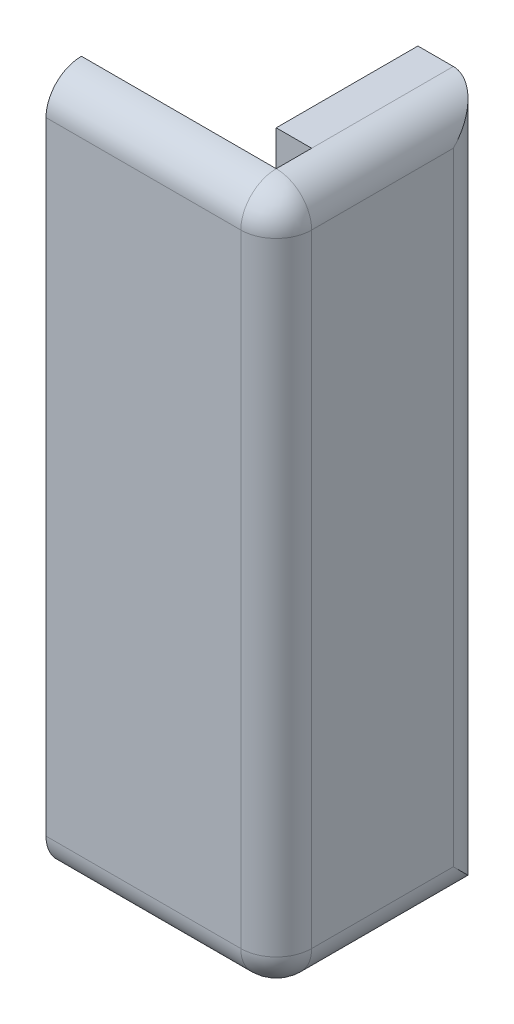
ISO-10303-21;
HEADER;
FILE_DESCRIPTION(('STEP AP214'),'2;1');
FILE_NAME('part.step','',(''),(''),'','','');
FILE_SCHEMA(('AUTOMOTIVE_DESIGN { 1 0 10303 214 1 1 1 1 }'));
ENDSEC;
DATA;
#1=APPLICATION_CONTEXT('core data for automotive mechanical design processes');
#2=APPLICATION_PROTOCOL_DEFINITION('international standard','automotive_design',2000,#1);
#3=PRODUCT_CONTEXT('',#1,'mechanical');
#4=PRODUCT('Part','Part','',(#3));
#5=PRODUCT_RELATED_PRODUCT_CATEGORY('part','',(#4));
#6=PRODUCT_DEFINITION_FORMATION('','',#4);
#7=PRODUCT_DEFINITION_CONTEXT('part definition',#1,'design');
#8=PRODUCT_DEFINITION('design','',#6,#7);
#9=PRODUCT_DEFINITION_SHAPE('','',#8);
#10=(LENGTH_UNIT() NAMED_UNIT(*) SI_UNIT(.MILLI.,.METRE.));
#11=(NAMED_UNIT(*) PLANE_ANGLE_UNIT() SI_UNIT($,.RADIAN.));
#12=(NAMED_UNIT(*) SI_UNIT($,.STERADIAN.) SOLID_ANGLE_UNIT());
#13=UNCERTAINTY_MEASURE_WITH_UNIT(LENGTH_MEASURE(1.E-05),#10,'distance_accuracy_value','');
#14=(GEOMETRIC_REPRESENTATION_CONTEXT(3) GLOBAL_UNCERTAINTY_ASSIGNED_CONTEXT((#13)) GLOBAL_UNIT_ASSIGNED_CONTEXT((#10,
#11,#12)) REPRESENTATION_CONTEXT('',''));
#15=CARTESIAN_POINT('',(0.,0.,0.));
#16=DIRECTION('',(0.,0.,1.));
#17=DIRECTION('',(1.,0.,0.));
#18=AXIS2_PLACEMENT_3D('',#15,#16,#17);
#19=CARTESIAN_POINT('',(73.8585658382883,57.3381408997306,-10.));
#20=DIRECTION('',(0.,0.,1.));
#21=DIRECTION('',(0.,-1.,0.));
#22=AXIS2_PLACEMENT_3D('',#19,#20,#21);
#23=PLANE('',#22);
#24=DIRECTION('',(-1.,0.,0.));
#25=VECTOR('',#24,1.);
#26=CARTESIAN_POINT('',(73.8585658382883,57.3381408997306,-10.));
#27=LINE('',#26,#25);
#28=CARTESIAN_POINT('',(63.8585658382883,57.3381408997306,-10.));
#29=VERTEX_POINT('',#28);
#30=CARTESIAN_POINT('',(53.8585658382883,57.3381408997309,-10.));
#31=VERTEX_POINT('',#30);
#32=EDGE_CURVE('E286',#29,#31,#27,.T.);
#33=ORIENTED_EDGE('',*,*,#32,.F.);
#34=DIRECTION('',(0.,1.,0.));
#35=VECTOR('',#34,1.);
#36=CARTESIAN_POINT('',(63.8585658382883,-138.351935642523,-9.99999999999901));
#37=LINE('',#36,#35);
#38=CARTESIAN_POINT('',(63.8585658382883,19.5358217023109,-9.99999999999999));
#39=VERTEX_POINT('',#38);
#40=EDGE_CURVE('E11',#29,#39,#37,.F.);
#41=ORIENTED_EDGE('',*,*,#40,.T.);
#42=DIRECTION('',(1.,0.,0.));
#43=VECTOR('',#42,1.);
#44=CARTESIAN_POINT('',(53.8585658382883,19.5358217023109,-9.99999999999999));
#45=LINE('',#44,#43);
#46=CARTESIAN_POINT('',(53.8585658382883,19.5358217023109,-9.99999999999999));
#47=VERTEX_POINT('',#46);
#48=EDGE_CURVE('E272',#47,#39,#45,.T.);
#49=ORIENTED_EDGE('',*,*,#48,.F.);
#50=DIRECTION('',(0.,-1.,0.));
#51=VECTOR('',#50,1.);
#52=CARTESIAN_POINT('',(53.8585658382883,19.5358217023109,-9.99999999999999));
#53=LINE('',#52,#51);
#54=EDGE_CURVE('E270',#31,#47,#53,.T.);
#55=ORIENTED_EDGE('',*,*,#54,.F.);
#56=EDGE_LOOP('',(#33,#41,#49,#55));
#57=FACE_BOUND('',#56,.T.);
#58=ADVANCED_FACE('F37',(#57),#23,.F.);
#59=CARTESIAN_POINT('',(63.8585658382883,0.,0.));
#60=DIRECTION('',(1.,0.,0.));
#61=DIRECTION('',(0.,1.,0.));
#62=AXIS2_PLACEMENT_3D('',#59,#60,#61);
#63=PLANE('',#62);
#64=DIRECTION('',(0.,0.,-1.));
#65=VECTOR('',#64,1.);
#66=CARTESIAN_POINT('',(63.8585658382883,-90.4641782976895,-9.99999999999925));
#67=LINE('',#66,#65);
#68=CARTESIAN_POINT('',(63.8585658382883,-90.4641782976895,40.));
#69=VERTEX_POINT('',#68);
#70=CARTESIAN_POINT('',(63.8585658382883,-90.4641782976895,-9.99999999999925));
#71=VERTEX_POINT('',#70);
#72=EDGE_CURVE('E153',#69,#71,#67,.T.);
#73=ORIENTED_EDGE('',*,*,#72,.F.);
#74=DIRECTION('',(0.,1.,0.));
#75=VECTOR('',#74,1.);
#76=CARTESIAN_POINT('',(63.8585658382883,57.3381408997309,40.));
#77=LINE('',#76,#75);
#78=CARTESIAN_POINT('',(63.8585658382883,57.3381408997309,40.));
#79=VERTEX_POINT('',#78);
#80=EDGE_CURVE('E166',#69,#79,#77,.T.);
#81=ORIENTED_EDGE('',*,*,#80,.T.);
#82=DIRECTION('',(0.,0.,1.));
#83=VECTOR('',#82,1.);
#84=CARTESIAN_POINT('',(63.8585658382883,57.3381408997309,50.));
#85=LINE('',#84,#83);
#86=CARTESIAN_POINT('',(63.8585658382883,57.3381408997309,30.0000000000002));
#87=VERTEX_POINT('',#86);
#88=EDGE_CURVE('E284',#87,#79,#85,.T.);
#89=ORIENTED_EDGE('',*,*,#88,.F.);
#90=DIRECTION('',(0.,1.,0.));
#91=VECTOR('',#90,1.);
#92=CARTESIAN_POINT('',(63.8585658382883,19.5358217023109,30.0000000000002));
#93=LINE('',#92,#91);
#94=CARTESIAN_POINT('',(63.8585658382883,19.5358217023109,30.0000000000002));
#95=VERTEX_POINT('',#94);
#96=EDGE_CURVE('E265',#95,#87,#93,.T.);
#97=ORIENTED_EDGE('',*,*,#96,.F.);
#98=DIRECTION('',(0.,0.,1.));
#99=VECTOR('',#98,1.);
#100=CARTESIAN_POINT('',(63.8585658382883,19.5358217023109,30.0000000000002));
#101=LINE('',#100,#99);
#102=EDGE_CURVE('E171',#39,#95,#101,.T.);
#103=ORIENTED_EDGE('',*,*,#102,.F.);
#104=DIRECTION('',(0.,1.,0.));
#105=VECTOR('',#104,1.);
#106=CARTESIAN_POINT('',(63.8585658382883,57.3381408997306,-10.));
#107=LINE('',#106,#105);
#108=EDGE_CURVE('E170',#71,#39,#107,.T.);
#109=ORIENTED_EDGE('',*,*,#108,.F.);
#110=EDGE_LOOP('',(#73,#81,#89,#97,#103,#109));
#111=FACE_BOUND('',#110,.T.);
#112=ADVANCED_FACE('F164',(#111),#63,.F.);
#113=DIRECTION('',(0.,1.,0.));
#114=VECTOR('',#113,1.);
#115=CARTESIAN_POINT('',(63.8585658382883,-90.4641782976895,40.));
#116=LINE('',#115,#114);
#117=CARTESIAN_POINT('',(63.8585658382883,-138.351935642523,40.));
#118=VERTEX_POINT('',#117);
#119=CARTESIAN_POINT('',(63.8585658382883,-138.266497495109,40.));
#120=VERTEX_POINT('',#119);
#121=EDGE_CURVE('E172',#118,#120,#116,.T.);
#122=ORIENTED_EDGE('',*,*,#121,.F.);
#123=CARTESIAN_POINT('',(63.8585658382883,-128.351935642523,40.));
#124=DIRECTION('',(1.,0.,0.));
#125=DIRECTION('',(0.,1.,0.));
#126=AXIS2_PLACEMENT_3D('',#123,#124,#125);
#127=CIRCLE('',#126,10.);
#128=CARTESIAN_POINT('',(63.8585658382883,-138.266497495109,41.3044014992449));
#129=VERTEX_POINT('',#128);
#130=EDGE_CURVE('E194',#118,#129,#127,.F.);
#131=ORIENTED_EDGE('',*,*,#130,.T.);
#132=DIRECTION('',(0.,0.,-1.));
#133=VECTOR('',#132,1.);
#134=CARTESIAN_POINT('',(63.8585658382883,-138.266497495109,50.));
#135=LINE('',#134,#133);
#136=EDGE_CURVE('E188',#129,#120,#135,.T.);
#137=ORIENTED_EDGE('',*,*,#136,.T.);
#138=EDGE_LOOP('',(#122,#131,#137));
#139=FACE_BOUND('',#138,.T.);
#140=ADVANCED_FACE('F372',(#139),#63,.F.);
#141=CARTESIAN_POINT('',(0.,0.,40.));
#142=DIRECTION('',(0.,0.,1.));
#143=DIRECTION('',(1.,0.,0.));
#144=AXIS2_PLACEMENT_3D('',#141,#142,#143);
#145=PLANE('',#144);
#146=DIRECTION('',(1.,0.,0.));
#147=VECTOR('',#146,1.);
#148=CARTESIAN_POINT('',(53.8585658382883,-90.4641782976895,40.));
#149=LINE('',#148,#147);
#150=CARTESIAN_POINT('',(53.8585658382883,-90.4641782976895,40.));
#151=VERTEX_POINT('',#150);
#152=EDGE_CURVE('E149',#151,#69,#149,.T.);
#153=ORIENTED_EDGE('',*,*,#152,.F.);
#154=DIRECTION('',(0.,1.,0.));
#155=VECTOR('',#154,1.);
#156=CARTESIAN_POINT('',(53.8585658382883,0.,40.));
#157=LINE('',#156,#155);
#158=CARTESIAN_POINT('',(53.8585658382883,-138.266497495109,40.));
#159=VERTEX_POINT('',#158);
#160=EDGE_CURVE('E192',#159,#151,#157,.T.);
#161=ORIENTED_EDGE('',*,*,#160,.F.);
#162=DIRECTION('',(1.,0.,0.));
#163=VECTOR('',#162,1.);
#164=CARTESIAN_POINT('',(8.85856583828835,-138.266497495109,40.));
#165=LINE('',#164,#163);
#166=CARTESIAN_POINT('',(8.85856583828835,-138.266497495109,40.));
#167=VERTEX_POINT('',#166);
#168=EDGE_CURVE('E179',#167,#159,#165,.T.);
#169=ORIENTED_EDGE('',*,*,#168,.F.);
#170=DIRECTION('',(0.,-1.,0.));
#171=VECTOR('',#170,1.);
#172=CARTESIAN_POINT('',(8.85856583828834,57.3381408997309,40.));
#173=LINE('',#172,#171);
#174=CARTESIAN_POINT('',(8.85856583828834,57.3381408997309,40.));
#175=VERTEX_POINT('',#174);
#176=EDGE_CURVE('E290',#175,#167,#173,.T.);
#177=ORIENTED_EDGE('',*,*,#176,.F.);
#178=DIRECTION('',(-1.,0.,0.));
#179=VECTOR('',#178,1.);
#180=CARTESIAN_POINT('',(8.85856583828834,57.3381408997309,40.));
#181=LINE('',#180,#179);
#182=EDGE_CURVE('E177',#79,#175,#181,.T.);
#183=ORIENTED_EDGE('',*,*,#182,.F.);
#184=ORIENTED_EDGE('',*,*,#80,.F.);
#185=EDGE_LOOP('',(#153,#161,#169,#177,#183,#184));
#186=FACE_BOUND('',#185,.T.);
#187=ADVANCED_FACE('F174',(#186),#145,.F.);
#188=CARTESIAN_POINT('',(8.85856583828834,57.3381408997309,50.));
#189=DIRECTION('',(1.,0.,0.));
#190=DIRECTION('',(0.,1.,0.));
#191=AXIS2_PLACEMENT_3D('',#188,#189,#190);
#192=PLANE('',#191);
#193=DIRECTION('',(0.,0.,-1.));
#194=VECTOR('',#193,1.);
#195=CARTESIAN_POINT('',(8.85856583828835,-138.266497495109,50.));
#196=LINE('',#195,#194);
#197=CARTESIAN_POINT('',(8.85856583828835,-138.266497495109,41.3044014992449));
#198=VERTEX_POINT('',#197);
#199=EDGE_CURVE('E190',#198,#167,#196,.T.);
#200=ORIENTED_EDGE('',*,*,#199,.F.);
#201=CARTESIAN_POINT('',(8.85856583828835,-128.351935642523,40.));
#202=DIRECTION('',(1.,0.,0.));
#203=DIRECTION('',(0.,1.,0.));
#204=AXIS2_PLACEMENT_3D('',#201,#202,#203);
#205=CIRCLE('',#204,10.);
#206=CARTESIAN_POINT('',(8.85856583828835,-128.351935642523,50.));
#207=VERTEX_POINT('',#206);
#208=EDGE_CURVE('E201',#198,#207,#205,.F.);
#209=ORIENTED_EDGE('',*,*,#208,.T.);
#210=DIRECTION('',(0.,-1.,0.));
#211=VECTOR('',#210,1.);
#212=CARTESIAN_POINT('',(8.85856583828834,57.3381408997309,50.));
#213=LINE('',#212,#211);
#214=CARTESIAN_POINT('',(8.85856583828834,47.3381408997309,50.));
#215=VERTEX_POINT('',#214);
#216=EDGE_CURVE('E181',#215,#207,#213,.T.);
#217=ORIENTED_EDGE('',*,*,#216,.F.);
#218=CARTESIAN_POINT('',(8.85856583828834,47.3381408997309,40.));
#219=DIRECTION('',(1.,0.,0.));
#220=DIRECTION('',(0.,1.,0.));
#221=AXIS2_PLACEMENT_3D('',#218,#219,#220);
#222=CIRCLE('',#221,10.);
#223=EDGE_CURVE('E199',#215,#175,#222,.F.);
#224=ORIENTED_EDGE('',*,*,#223,.T.);
#225=ORIENTED_EDGE('',*,*,#176,.T.);
#226=EDGE_LOOP('',(#200,#209,#217,#224,#225));
#227=FACE_BOUND('',#226,.T.);
#228=ADVANCED_FACE('F317',(#227),#192,.F.);
#229=CARTESIAN_POINT('',(8.85856583828835,-138.266497495109,50.));
#230=DIRECTION('',(0.,1.,0.));
#231=DIRECTION('',(0.,0.,1.));
#232=AXIS2_PLACEMENT_3D('',#229,#230,#231);
#233=PLANE('',#232);
#234=ORIENTED_EDGE('',*,*,#136,.F.);
#235=DIRECTION('',(1.,0.,0.));
#236=VECTOR('',#235,1.);
#237=CARTESIAN_POINT('',(63.8585658382883,-138.266497495109,41.3044014992449));
#238=LINE('',#237,#236);
#239=EDGE_CURVE('E197',#129,#198,#238,.F.);
#240=ORIENTED_EDGE('',*,*,#239,.T.);
#241=ORIENTED_EDGE('',*,*,#199,.T.);
#242=ORIENTED_EDGE('',*,*,#168,.T.);
#243=EDGE_CURVE('E184',#159,#120,#165,.T.);
#244=ORIENTED_EDGE('',*,*,#243,.T.);
#245=EDGE_LOOP('',(#234,#240,#241,#242,#244));
#246=FACE_BOUND('',#245,.T.);
#247=ADVANCED_FACE('F298',(#246),#233,.F.);
#248=CARTESIAN_POINT('',(8.85856583828834,57.3381408997309,50.));
#249=DIRECTION('',(0.,-1.,0.));
#250=DIRECTION('',(0.,0.,-1.));
#251=AXIS2_PLACEMENT_3D('',#248,#249,#250);
#252=PLANE('',#251);
#253=DIRECTION('',(1.,0.,0.));
#254=VECTOR('',#253,1.);
#255=CARTESIAN_POINT('',(53.8585658382883,57.3381408997309,30.0000000000002));
#256=LINE('',#255,#254);
#257=CARTESIAN_POINT('',(53.8585658382883,57.3381408997309,30.0000000000002));
#258=VERTEX_POINT('',#257);
#259=EDGE_CURVE('E278',#258,#87,#256,.T.);
#260=ORIENTED_EDGE('',*,*,#259,.T.);
#261=DIRECTION('',(0.,0.,1.));
#262=VECTOR('',#261,1.);
#263=CARTESIAN_POINT('',(63.8585658382883,57.3381408997309,-10.));
#264=LINE('',#263,#262);
#265=EDGE_CURVE('E210',#87,#29,#264,.F.);
#266=ORIENTED_EDGE('',*,*,#265,.T.);
#267=ORIENTED_EDGE('',*,*,#32,.T.);
#268=DIRECTION('',(0.,0.,-1.));
#269=VECTOR('',#268,1.);
#270=CARTESIAN_POINT('',(53.8585658382883,57.3381408997309,30.0000000000002));
#271=LINE('',#270,#269);
#272=EDGE_CURVE('E267',#258,#31,#271,.T.);
#273=ORIENTED_EDGE('',*,*,#272,.F.);
#274=EDGE_LOOP('',(#260,#266,#267,#273));
#275=FACE_BOUND('',#274,.T.);
#276=ADVANCED_FACE('F343',(#275),#252,.F.);
#277=CARTESIAN_POINT('',(0.,0.,50.));
#278=DIRECTION('',(0.,0.,1.));
#279=DIRECTION('',(1.,0.,0.));
#280=AXIS2_PLACEMENT_3D('',#277,#278,#279);
#281=PLANE('',#280);
#282=ORIENTED_EDGE('',*,*,#216,.T.);
#283=DIRECTION('',(-1.,0.,0.));
#284=VECTOR('',#283,1.);
#285=CARTESIAN_POINT('',(73.8585658382883,-128.351935642523,50.));
#286=LINE('',#285,#284);
#287=CARTESIAN_POINT('',(63.8585658382883,-128.351935642523,50.));
#288=VERTEX_POINT('',#287);
#289=EDGE_CURVE('E207',#207,#288,#286,.F.);
#290=ORIENTED_EDGE('',*,*,#289,.T.);
#291=DIRECTION('',(0.,-1.,0.));
#292=VECTOR('',#291,1.);
#293=CARTESIAN_POINT('',(63.8585658382883,0.,50.));
#294=LINE('',#293,#292);
#295=CARTESIAN_POINT('',(63.8585658382883,47.3381408997309,50.));
#296=VERTEX_POINT('',#295);
#297=EDGE_CURVE('E203',#288,#296,#294,.F.);
#298=ORIENTED_EDGE('',*,*,#297,.T.);
#299=DIRECTION('',(-1.,0.,0.));
#300=VECTOR('',#299,1.);
#301=CARTESIAN_POINT('',(8.85856583828834,47.3381408997309,50.));
#302=LINE('',#301,#300);
#303=EDGE_CURVE('E205',#296,#215,#302,.T.);
#304=ORIENTED_EDGE('',*,*,#303,.T.);
#305=EDGE_LOOP('',(#282,#290,#298,#304));
#306=FACE_BOUND('',#305,.T.);
#307=ADVANCED_FACE('F314',(#306),#281,.T.);
#308=CARTESIAN_POINT('',(73.8585658382883,-138.351935642523,50.000000000001));
#309=DIRECTION('',(0.,1.,0.));
#310=DIRECTION('',(0.,0.,1.));
#311=AXIS2_PLACEMENT_3D('',#308,#309,#310);
#312=PLANE('',#311);
#313=DIRECTION('',(-1.,0.,0.));
#314=VECTOR('',#313,1.);
#315=CARTESIAN_POINT('',(73.8585658382883,-138.351935642523,-9.99999999999901));
#316=LINE('',#315,#314);
#317=CARTESIAN_POINT('',(63.8585658382883,-138.351935642523,-9.99999999999901));
#318=VERTEX_POINT('',#317);
#319=CARTESIAN_POINT('',(53.8585658382883,-138.351935642523,-9.99999999999901));
#320=VERTEX_POINT('',#319);
#321=EDGE_CURVE('E288',#318,#320,#316,.T.);
#322=ORIENTED_EDGE('',*,*,#321,.F.);
#323=DIRECTION('',(0.,0.,-1.));
#324=VECTOR('',#323,1.);
#325=CARTESIAN_POINT('',(63.8585658382883,-138.351935642523,50.000000000001));
#326=LINE('',#325,#324);
#327=EDGE_CURVE('E219',#318,#118,#326,.F.);
#328=ORIENTED_EDGE('',*,*,#327,.T.);
#329=DIRECTION('',(1.,0.,0.));
#330=VECTOR('',#329,1.);
#331=CARTESIAN_POINT('',(53.8585658382883,-138.351935642523,40.));
#332=LINE('',#331,#330);
#333=CARTESIAN_POINT('',(53.8585658382883,-138.351935642523,40.));
#334=VERTEX_POINT('',#333);
#335=EDGE_CURVE('E160',#334,#118,#332,.T.);
#336=ORIENTED_EDGE('',*,*,#335,.F.);
#337=DIRECTION('',(0.,0.,1.));
#338=VECTOR('',#337,1.);
#339=CARTESIAN_POINT('',(53.8585658382883,-138.351935642523,-9.99999999999901));
#340=LINE('',#339,#338);
#341=EDGE_CURVE('E255',#320,#334,#340,.T.);
#342=ORIENTED_EDGE('',*,*,#341,.F.);
#343=EDGE_LOOP('',(#322,#328,#336,#342));
#344=FACE_BOUND('',#343,.T.);
#345=ADVANCED_FACE('F376',(#344),#312,.F.);
#346=DIRECTION('',(1.,0.,0.));
#347=VECTOR('',#346,1.);
#348=CARTESIAN_POINT('',(53.8585658382883,-90.4641782976895,-9.99999999999925));
#349=LINE('',#348,#347);
#350=CARTESIAN_POINT('',(53.8585658382883,-90.4641782976895,-9.99999999999925));
#351=VERTEX_POINT('',#350);
#352=EDGE_CURVE('E245',#351,#71,#349,.T.);
#353=ORIENTED_EDGE('',*,*,#352,.T.);
#354=DIRECTION('',(0.,1.,0.));
#355=VECTOR('',#354,1.);
#356=CARTESIAN_POINT('',(63.8585658382883,-138.351935642523,-9.99999999999901));
#357=LINE('',#356,#355);
#358=EDGE_CURVE('E46',#71,#318,#357,.F.);
#359=ORIENTED_EDGE('',*,*,#358,.T.);
#360=ORIENTED_EDGE('',*,*,#321,.T.);
#361=DIRECTION('',(0.,-1.,0.));
#362=VECTOR('',#361,1.);
#363=CARTESIAN_POINT('',(53.8585658382883,-90.4641782976895,-9.99999999999925));
#364=LINE('',#363,#362);
#365=EDGE_CURVE('E257',#351,#320,#364,.T.);
#366=ORIENTED_EDGE('',*,*,#365,.F.);
#367=EDGE_LOOP('',(#353,#359,#360,#366));
#368=FACE_BOUND('',#367,.T.);
#369=ADVANCED_FACE('F365',(#368),#23,.F.);
#370=CARTESIAN_POINT('',(73.8585658382883,0.,0.));
#371=DIRECTION('',(1.,0.,0.));
#372=DIRECTION('',(0.,1.,0.));
#373=AXIS2_PLACEMENT_3D('',#370,#371,#372);
#374=PLANE('',#373);
#375=DIRECTION('',(0.,0.,-1.));
#376=VECTOR('',#375,1.);
#377=CARTESIAN_POINT('',(73.8585658382883,-128.351935642523,-9.99999999999906));
#378=LINE('',#377,#376);
#379=CARTESIAN_POINT('',(73.8585658382883,-128.351935642523,40.));
#380=VERTEX_POINT('',#379);
#381=CARTESIAN_POINT('',(73.8585658382883,-128.351935642523,9.43113477191291E-13));
#382=VERTEX_POINT('',#381);
#383=EDGE_CURVE('E214',#380,#382,#378,.T.);
#384=ORIENTED_EDGE('',*,*,#383,.T.);
#385=DIRECTION('',(0.,1.,0.));
#386=VECTOR('',#385,1.);
#387=CARTESIAN_POINT('',(73.8585658382883,57.3381408997307,0.));
#388=LINE('',#387,#386);
#389=CARTESIAN_POINT('',(73.8585658382883,47.3381408997309,0.));
#390=VERTEX_POINT('',#389);
#391=EDGE_CURVE('E61',#382,#390,#388,.T.);
#392=ORIENTED_EDGE('',*,*,#391,.T.);
#393=DIRECTION('',(0.,0.,1.));
#394=VECTOR('',#393,1.);
#395=CARTESIAN_POINT('',(73.8585658382883,47.3381408997309,50.));
#396=LINE('',#395,#394);
#397=CARTESIAN_POINT('',(73.8585658382883,47.3381408997309,40.));
#398=VERTEX_POINT('',#397);
#399=EDGE_CURVE('E216',#390,#398,#396,.T.);
#400=ORIENTED_EDGE('',*,*,#399,.T.);
#401=DIRECTION('',(0.,-1.,0.));
#402=VECTOR('',#401,1.);
#403=CARTESIAN_POINT('',(73.8585658382883,0.,40.));
#404=LINE('',#403,#402);
#405=EDGE_CURVE('E212',#398,#380,#404,.T.);
#406=ORIENTED_EDGE('',*,*,#405,.T.);
#407=EDGE_LOOP('',(#384,#392,#400,#406));
#408=FACE_BOUND('',#407,.T.);
#409=ADVANCED_FACE('F332',(#408),#374,.T.);
#410=CARTESIAN_POINT('',(53.8585658382883,19.5358217023109,30.0000000000002));
#411=DIRECTION('',(0.,1.,0.));
#412=DIRECTION('',(-1.,0.,0.));
#413=AXIS2_PLACEMENT_3D('',#410,#411,#412);
#414=PLANE('',#413);
#415=ORIENTED_EDGE('',*,*,#102,.T.);
#416=DIRECTION('',(1.,0.,0.));
#417=VECTOR('',#416,1.);
#418=CARTESIAN_POINT('',(53.8585658382883,19.5358217023109,30.0000000000002));
#419=LINE('',#418,#417);
#420=CARTESIAN_POINT('',(53.8585658382883,19.5358217023109,30.0000000000002));
#421=VERTEX_POINT('',#420);
#422=EDGE_CURVE('E281',#421,#95,#419,.T.);
#423=ORIENTED_EDGE('',*,*,#422,.F.);
#424=DIRECTION('',(0.,0.,1.));
#425=VECTOR('',#424,1.);
#426=CARTESIAN_POINT('',(53.8585658382883,19.5358217023109,30.0000000000002));
#427=LINE('',#426,#425);
#428=EDGE_CURVE('E261',#47,#421,#427,.T.);
#429=ORIENTED_EDGE('',*,*,#428,.F.);
#430=ORIENTED_EDGE('',*,*,#48,.T.);
#431=EDGE_LOOP('',(#415,#423,#429,#430));
#432=FACE_BOUND('',#431,.T.);
#433=ADVANCED_FACE('F357',(#432),#414,.F.);
#434=CARTESIAN_POINT('',(53.8585658382883,19.5358217023109,30.0000000000002));
#435=DIRECTION('',(0.,0.,-1.));
#436=DIRECTION('',(-1.,0.,0.));
#437=AXIS2_PLACEMENT_3D('',#434,#435,#436);
#438=PLANE('',#437);
#439=ORIENTED_EDGE('',*,*,#96,.T.);
#440=ORIENTED_EDGE('',*,*,#259,.F.);
#441=DIRECTION('',(0.,1.,0.));
#442=VECTOR('',#441,1.);
#443=CARTESIAN_POINT('',(53.8585658382883,19.5358217023109,30.0000000000002));
#444=LINE('',#443,#442);
#445=EDGE_CURVE('E264',#421,#258,#444,.T.);
#446=ORIENTED_EDGE('',*,*,#445,.F.);
#447=ORIENTED_EDGE('',*,*,#422,.T.);
#448=EDGE_LOOP('',(#439,#440,#446,#447));
#449=FACE_BOUND('',#448,.T.);
#450=ADVANCED_FACE('F354',(#449),#438,.F.);
#451=CARTESIAN_POINT('',(53.8585658382883,0.,0.));
#452=DIRECTION('',(1.,0.,0.));
#453=DIRECTION('',(0.,1.,0.));
#454=AXIS2_PLACEMENT_3D('',#451,#452,#453);
#455=PLANE('',#454);
#456=ORIENTED_EDGE('',*,*,#428,.T.);
#457=ORIENTED_EDGE('',*,*,#445,.T.);
#458=ORIENTED_EDGE('',*,*,#272,.T.);
#459=ORIENTED_EDGE('',*,*,#54,.T.);
#460=EDGE_LOOP('',(#456,#457,#458,#459));
#461=FACE_BOUND('',#460,.T.);
#462=ADVANCED_FACE('F351',(#461),#455,.F.);
#463=CARTESIAN_POINT('',(53.8585658382883,-90.4641782976895,40.));
#464=DIRECTION('',(0.,0.,-1.));
#465=DIRECTION('',(-1.,0.,0.));
#466=AXIS2_PLACEMENT_3D('',#463,#464,#465);
#467=PLANE('',#466);
#468=ORIENTED_EDGE('',*,*,#121,.T.);
#469=ORIENTED_EDGE('',*,*,#243,.F.);
#470=DIRECTION('',(0.,1.,0.));
#471=VECTOR('',#470,1.);
#472=CARTESIAN_POINT('',(53.8585658382883,-90.4641782976895,40.));
#473=LINE('',#472,#471);
#474=EDGE_CURVE('E159',#334,#159,#473,.T.);
#475=ORIENTED_EDGE('',*,*,#474,.F.);
#476=ORIENTED_EDGE('',*,*,#335,.T.);
#477=EDGE_LOOP('',(#468,#469,#475,#476));
#478=FACE_BOUND('',#477,.T.);
#479=ADVANCED_FACE('F303',(#478),#467,.F.);
#480=CARTESIAN_POINT('',(53.8585658382883,-90.4641782976895,-9.99999999999925));
#481=DIRECTION('',(0.,-1.,0.));
#482=DIRECTION('',(0.,0.,-1.));
#483=AXIS2_PLACEMENT_3D('',#480,#481,#482);
#484=PLANE('',#483);
#485=ORIENTED_EDGE('',*,*,#72,.T.);
#486=ORIENTED_EDGE('',*,*,#352,.F.);
#487=DIRECTION('',(0.,0.,-1.));
#488=VECTOR('',#487,1.);
#489=CARTESIAN_POINT('',(53.8585658382883,-90.4641782976895,-9.99999999999925));
#490=LINE('',#489,#488);
#491=EDGE_CURVE('E155',#151,#351,#490,.T.);
#492=ORIENTED_EDGE('',*,*,#491,.F.);
#493=ORIENTED_EDGE('',*,*,#152,.T.);
#494=EDGE_LOOP('',(#485,#486,#492,#493));
#495=FACE_BOUND('',#494,.T.);
#496=ADVANCED_FACE('F151',(#495),#484,.F.);
#497=CARTESIAN_POINT('',(53.8585658382883,0.,0.));
#498=DIRECTION('',(1.,0.,0.));
#499=DIRECTION('',(0.,0.,-1.));
#500=AXIS2_PLACEMENT_3D('',#497,#498,#499);
#501=PLANE('',#500);
#502=ORIENTED_EDGE('',*,*,#491,.T.);
#503=ORIENTED_EDGE('',*,*,#365,.T.);
#504=ORIENTED_EDGE('',*,*,#341,.T.);
#505=ORIENTED_EDGE('',*,*,#474,.T.);
#506=ORIENTED_EDGE('',*,*,#160,.T.);
#507=EDGE_LOOP('',(#502,#503,#504,#505,#506));
#508=FACE_BOUND('',#507,.T.);
#509=ADVANCED_FACE('F306',(#508),#501,.F.);
#510=CARTESIAN_POINT('',(0.,47.3381408997309,40.));
#511=DIRECTION('',(1.,0.,0.));
#512=DIRECTION('',(0.,0.,-1.));
#513=AXIS2_PLACEMENT_3D('',#510,#511,#512);
#514=CYLINDRICAL_SURFACE('',#513,10.);
#515=ORIENTED_EDGE('',*,*,#223,.F.);
#516=ORIENTED_EDGE('',*,*,#303,.F.);
#517=CARTESIAN_POINT('',(63.8585658382883,47.3381408997309,40.));
#518=DIRECTION('',(1.,0.,0.));
#519=DIRECTION('',(0.,0.,-1.));
#520=AXIS2_PLACEMENT_3D('',#517,#518,#519);
#521=CIRCLE('',#520,10.);
#522=EDGE_CURVE('E41',#79,#296,#521,.T.);
#523=ORIENTED_EDGE('',*,*,#522,.F.);
#524=ORIENTED_EDGE('',*,*,#182,.T.);
#525=EDGE_LOOP('',(#515,#516,#523,#524));
#526=FACE_BOUND('',#525,.T.);
#527=ADVANCED_FACE('F39',(#526),#514,.T.);
#528=CARTESIAN_POINT('',(63.8585658382883,47.3381408997309,0.));
#529=DIRECTION('',(0.,0.,-1.));
#530=DIRECTION('',(-1.,0.,0.));
#531=AXIS2_PLACEMENT_3D('',#528,#529,#530);
#532=CYLINDRICAL_SURFACE('',#531,10.);
#533=ORIENTED_EDGE('',*,*,#265,.F.);
#534=ORIENTED_EDGE('',*,*,#88,.T.);
#535=CARTESIAN_POINT('',(63.8585658382883,47.3381408997309,40.));
#536=DIRECTION('',(0.,0.,1.));
#537=DIRECTION('',(1.,0.,0.));
#538=AXIS2_PLACEMENT_3D('',#535,#536,#537);
#539=CIRCLE('',#538,10.);
#540=EDGE_CURVE('E239',#398,#79,#539,.T.);
#541=ORIENTED_EDGE('',*,*,#540,.F.);
#542=ORIENTED_EDGE('',*,*,#399,.F.);
#543=CARTESIAN_POINT('',(63.8585658382883,47.3381408997309,0.));
#544=DIRECTION('',(0.,-0.707106781186549,-0.707106781186546));
#545=DIRECTION('',(0.,-0.707106781186546,0.707106781186549));
#546=AXIS2_PLACEMENT_3D('',#543,#544,#545);
#547=ELLIPSE('',#546,14.142135623731,10.);
#548=EDGE_CURVE('E237',#29,#390,#547,.T.);
#549=ORIENTED_EDGE('',*,*,#548,.F.);
#550=EDGE_LOOP('',(#533,#534,#541,#542,#549));
#551=FACE_BOUND('',#550,.T.);
#552=ADVANCED_FACE('F330',(#551),#532,.T.);
#553=CARTESIAN_POINT('',(63.8585658382883,47.3381408997309,40.));
#554=DIRECTION('',(0.,1.,0.));
#555=DIRECTION('',(0.,0.,1.));
#556=AXIS2_PLACEMENT_3D('',#553,#554,#555);
#557=SPHERICAL_SURFACE('',#556,10.);
#558=ORIENTED_EDGE('',*,*,#540,.T.);
#559=ORIENTED_EDGE('',*,*,#522,.T.);
#560=CARTESIAN_POINT('',(63.8585658382883,47.3381408997309,40.));
#561=DIRECTION('',(0.,1.,0.));
#562=DIRECTION('',(0.,0.,1.));
#563=AXIS2_PLACEMENT_3D('',#560,#561,#562);
#564=CIRCLE('',#563,10.);
#565=EDGE_CURVE('E234',#398,#296,#564,.F.);
#566=ORIENTED_EDGE('',*,*,#565,.F.);
#567=EDGE_LOOP('',(#558,#559,#566));
#568=FACE_BOUND('',#567,.T.);
#569=ADVANCED_FACE('F327',(#568),#557,.T.);
#570=CARTESIAN_POINT('',(63.8585658382883,0.,2.90019366282229E-13));
#571=DIRECTION('',(0.,-1.,0.));
#572=DIRECTION('',(0.,0.,-1.));
#573=AXIS2_PLACEMENT_3D('',#570,#571,#572);
#574=CYLINDRICAL_SURFACE('',#573,10.);
#575=ORIENTED_EDGE('',*,*,#548,.T.);
#576=ORIENTED_EDGE('',*,*,#391,.F.);
#577=CARTESIAN_POINT('',(63.8585658382883,-128.351935642523,9.43113477191292E-13));
#578=DIRECTION('',(0.,-0.707106781186544,0.707106781186551));
#579=DIRECTION('',(0.,-0.707106781186551,-0.707106781186544));
#580=AXIS2_PLACEMENT_3D('',#577,#578,#579);
#581=ELLIPSE('',#580,14.1421356237309,10.);
#582=EDGE_CURVE('E231',#318,#382,#581,.T.);
#583=ORIENTED_EDGE('',*,*,#582,.F.);
#584=ORIENTED_EDGE('',*,*,#358,.F.);
#585=ORIENTED_EDGE('',*,*,#108,.T.);
#586=ORIENTED_EDGE('',*,*,#40,.F.);
#587=EDGE_LOOP('',(#575,#576,#583,#584,#585,#586));
#588=FACE_BOUND('',#587,.T.);
#589=ADVANCED_FACE('F339',(#588),#574,.T.);
#590=CARTESIAN_POINT('',(63.8585658382883,0.,40.));
#591=DIRECTION('',(0.,-1.,0.));
#592=DIRECTION('',(1.,0.,0.));
#593=AXIS2_PLACEMENT_3D('',#590,#591,#592);
#594=CYLINDRICAL_SURFACE('',#593,10.);
#595=ORIENTED_EDGE('',*,*,#565,.T.);
#596=ORIENTED_EDGE('',*,*,#297,.F.);
#597=CARTESIAN_POINT('',(63.8585658382883,-128.351935642523,40.));
#598=DIRECTION('',(0.,-1.,0.));
#599=DIRECTION('',(0.,0.,-1.));
#600=AXIS2_PLACEMENT_3D('',#597,#598,#599);
#601=CIRCLE('',#600,10.);
#602=EDGE_CURVE('E228',#380,#288,#601,.T.);
#603=ORIENTED_EDGE('',*,*,#602,.F.);
#604=ORIENTED_EDGE('',*,*,#405,.F.);
#605=EDGE_LOOP('',(#595,#596,#603,#604));
#606=FACE_BOUND('',#605,.T.);
#607=ADVANCED_FACE('F326',(#606),#594,.T.);
#608=CARTESIAN_POINT('',(63.8585658382883,-128.351935642523,6.53121673442037E-13));
#609=DIRECTION('',(0.,0.,1.));
#610=DIRECTION('',(0.,-1.,0.));
#611=AXIS2_PLACEMENT_3D('',#608,#609,#610);
#612=CYLINDRICAL_SURFACE('',#611,10.);
#613=ORIENTED_EDGE('',*,*,#582,.T.);
#614=ORIENTED_EDGE('',*,*,#383,.F.);
#615=CARTESIAN_POINT('',(63.8585658382883,-128.351935642523,40.));
#616=DIRECTION('',(0.,0.,1.));
#617=DIRECTION('',(0.,-1.,0.));
#618=AXIS2_PLACEMENT_3D('',#615,#616,#617);
#619=CIRCLE('',#618,10.);
#620=EDGE_CURVE('E225',#118,#380,#619,.T.);
#621=ORIENTED_EDGE('',*,*,#620,.F.);
#622=ORIENTED_EDGE('',*,*,#327,.F.);
#623=EDGE_LOOP('',(#613,#614,#621,#622));
#624=FACE_BOUND('',#623,.T.);
#625=ADVANCED_FACE('F335',(#624),#612,.T.);
#626=CARTESIAN_POINT('',(63.8585658382883,-128.351935642523,40.));
#627=DIRECTION('',(1.,0.,0.));
#628=DIRECTION('',(0.,0.,-1.));
#629=AXIS2_PLACEMENT_3D('',#626,#627,#628);
#630=SPHERICAL_SURFACE('',#629,10.);
#631=ORIENTED_EDGE('',*,*,#620,.T.);
#632=ORIENTED_EDGE('',*,*,#602,.T.);
#633=CARTESIAN_POINT('',(63.8585658382883,-128.351935642523,40.));
#634=DIRECTION('',(1.,0.,0.));
#635=DIRECTION('',(0.,0.,-1.));
#636=AXIS2_PLACEMENT_3D('',#633,#634,#635);
#637=CIRCLE('',#636,10.);
#638=EDGE_CURVE('E223',#129,#288,#637,.F.);
#639=ORIENTED_EDGE('',*,*,#638,.F.);
#640=ORIENTED_EDGE('',*,*,#130,.F.);
#641=EDGE_LOOP('',(#631,#632,#639,#640));
#642=FACE_BOUND('',#641,.T.);
#643=ADVANCED_FACE('F323',(#642),#630,.T.);
#644=CARTESIAN_POINT('',(73.8585658382883,-128.351935642523,40.));
#645=DIRECTION('',(1.,0.,0.));
#646=DIRECTION('',(0.,1.,0.));
#647=AXIS2_PLACEMENT_3D('',#644,#645,#646);
#648=CYLINDRICAL_SURFACE('',#647,10.);
#649=ORIENTED_EDGE('',*,*,#638,.T.);
#650=ORIENTED_EDGE('',*,*,#289,.F.);
#651=ORIENTED_EDGE('',*,*,#208,.F.);
#652=ORIENTED_EDGE('',*,*,#239,.F.);
#653=EDGE_LOOP('',(#649,#650,#651,#652));
#654=FACE_BOUND('',#653,.T.);
#655=ADVANCED_FACE('F320',(#654),#648,.T.);
#656=CLOSED_SHELL('',(#58,#112,#140,#187,#228,#247,#276,#307,#345,#369,#409,#433,#450,#462,#479,
#496,#509,#527,#552,#569,#589,#607,#625,#643,#655));
#657=MANIFOLD_SOLID_BREP('B2',#656);
#658=ADVANCED_BREP_SHAPE_REPRESENTATION('',(#18,#657),#14);
#659=SHAPE_DEFINITION_REPRESENTATION(#9,#658);
ENDSEC;
END-ISO-10303-21;
